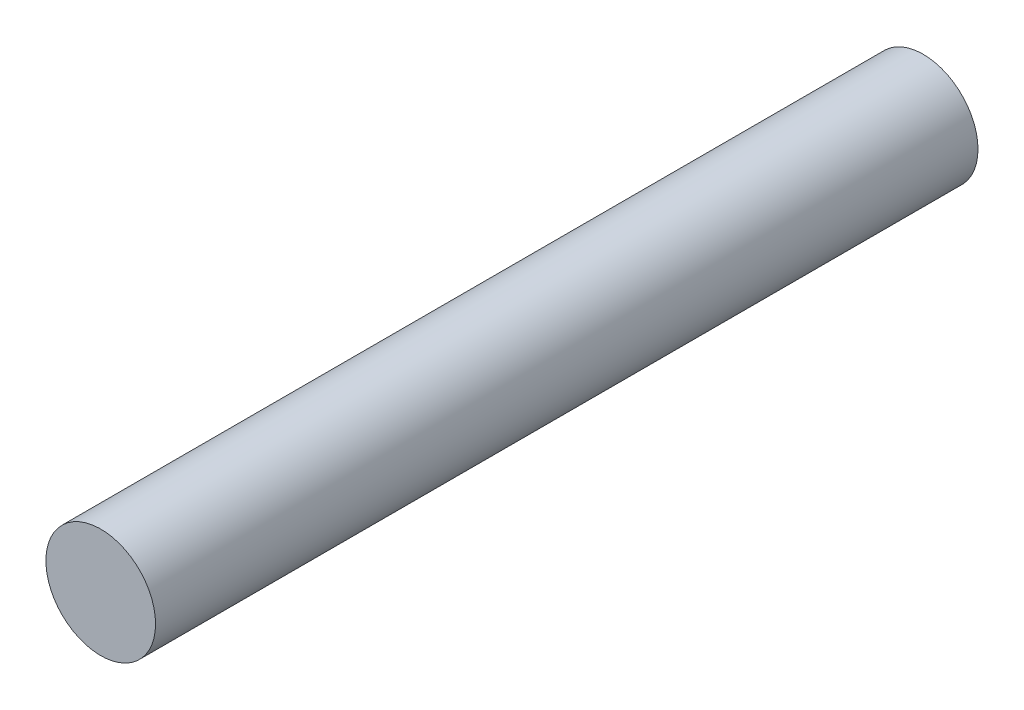
ISO-10303-21;
HEADER;
FILE_DESCRIPTION(('STEP AP214'),'2;1');
FILE_NAME('part.step','',(''),(''),'','','');
FILE_SCHEMA(('AUTOMOTIVE_DESIGN { 1 0 10303 214 1 1 1 1 }'));
ENDSEC;
DATA;
#1=APPLICATION_CONTEXT('core data for automotive mechanical design processes');
#2=APPLICATION_PROTOCOL_DEFINITION('international standard','automotive_design',2000,#1);
#3=PRODUCT_CONTEXT('',#1,'mechanical');
#4=PRODUCT('Part','Part','',(#3));
#5=PRODUCT_RELATED_PRODUCT_CATEGORY('part','',(#4));
#6=PRODUCT_DEFINITION_FORMATION('','',#4);
#7=PRODUCT_DEFINITION_CONTEXT('part definition',#1,'design');
#8=PRODUCT_DEFINITION('design','',#6,#7);
#9=PRODUCT_DEFINITION_SHAPE('','',#8);
#10=(LENGTH_UNIT() NAMED_UNIT(*) SI_UNIT(.MILLI.,.METRE.));
#11=(NAMED_UNIT(*) PLANE_ANGLE_UNIT() SI_UNIT($,.RADIAN.));
#12=(NAMED_UNIT(*) SI_UNIT($,.STERADIAN.) SOLID_ANGLE_UNIT());
#13=UNCERTAINTY_MEASURE_WITH_UNIT(LENGTH_MEASURE(1.E-05),#10,'distance_accuracy_value','');
#14=(GEOMETRIC_REPRESENTATION_CONTEXT(3) GLOBAL_UNCERTAINTY_ASSIGNED_CONTEXT((#13)) GLOBAL_UNIT_ASSIGNED_CONTEXT((#10,
#11,#12)) REPRESENTATION_CONTEXT('',''));
#15=CARTESIAN_POINT('',(0.,0.,0.));
#16=DIRECTION('',(0.,0.,1.));
#17=DIRECTION('',(1.,0.,0.));
#18=AXIS2_PLACEMENT_3D('',#15,#16,#17);
#19=CARTESIAN_POINT('',(0.,0.,150.));
#20=DIRECTION('',(0.,0.,-1.));
#21=DIRECTION('',(-1.,0.,0.));
#22=AXIS2_PLACEMENT_3D('',#19,#20,#21);
#23=CYLINDRICAL_SURFACE('',#22,10.);
#24=CARTESIAN_POINT('',(0.,0.,150.));
#25=DIRECTION('',(0.,0.,1.));
#26=DIRECTION('',(1.,0.,0.));
#27=AXIS2_PLACEMENT_3D('',#24,#25,#26);
#28=CIRCLE('',#27,10.);
#29=CARTESIAN_POINT('',(10.,0.,150.));
#30=VERTEX_POINT('',#29);
#31=EDGE_CURVE('E10',#30,#30,#28,.T.);
#32=ORIENTED_EDGE('',*,*,#31,.F.);
#33=EDGE_LOOP('',(#32));
#34=FACE_BOUND('',#33,.T.);
#35=CARTESIAN_POINT('',(0.,0.,0.));
#36=DIRECTION('',(0.,0.,1.));
#37=DIRECTION('',(1.,0.,0.));
#38=AXIS2_PLACEMENT_3D('',#35,#36,#37);
#39=CIRCLE('',#38,10.);
#40=CARTESIAN_POINT('',(10.,0.,0.));
#41=VERTEX_POINT('',#40);
#42=EDGE_CURVE('E33',#41,#41,#39,.T.);
#43=ORIENTED_EDGE('',*,*,#42,.T.);
#44=EDGE_LOOP('',(#43));
#45=FACE_BOUND('',#44,.T.);
#46=ADVANCED_FACE('F30',(#34,#45),#23,.T.);
#47=CARTESIAN_POINT('',(0.,0.,150.));
#48=DIRECTION('',(0.,0.,1.));
#49=DIRECTION('',(1.,0.,0.));
#50=AXIS2_PLACEMENT_3D('',#47,#48,#49);
#51=PLANE('',#50);
#52=ORIENTED_EDGE('',*,*,#31,.T.);
#53=EDGE_LOOP('',(#52));
#54=FACE_BOUND('',#53,.T.);
#55=ADVANCED_FACE('F45',(#54),#51,.T.);
#56=CARTESIAN_POINT('',(0.,0.,0.));
#57=DIRECTION('',(0.,0.,1.));
#58=DIRECTION('',(1.,0.,0.));
#59=AXIS2_PLACEMENT_3D('',#56,#57,#58);
#60=PLANE('',#59);
#61=ORIENTED_EDGE('',*,*,#42,.F.);
#62=EDGE_LOOP('',(#61));
#63=FACE_BOUND('',#62,.T.);
#64=ADVANCED_FACE('F43',(#63),#60,.F.);
#65=CLOSED_SHELL('',(#46,#55,#64));
#66=MANIFOLD_SOLID_BREP('B2',#65);
#67=ADVANCED_BREP_SHAPE_REPRESENTATION('',(#18,#66),#14);
#68=SHAPE_DEFINITION_REPRESENTATION(#9,#67);
ENDSEC;
END-ISO-10303-21;
